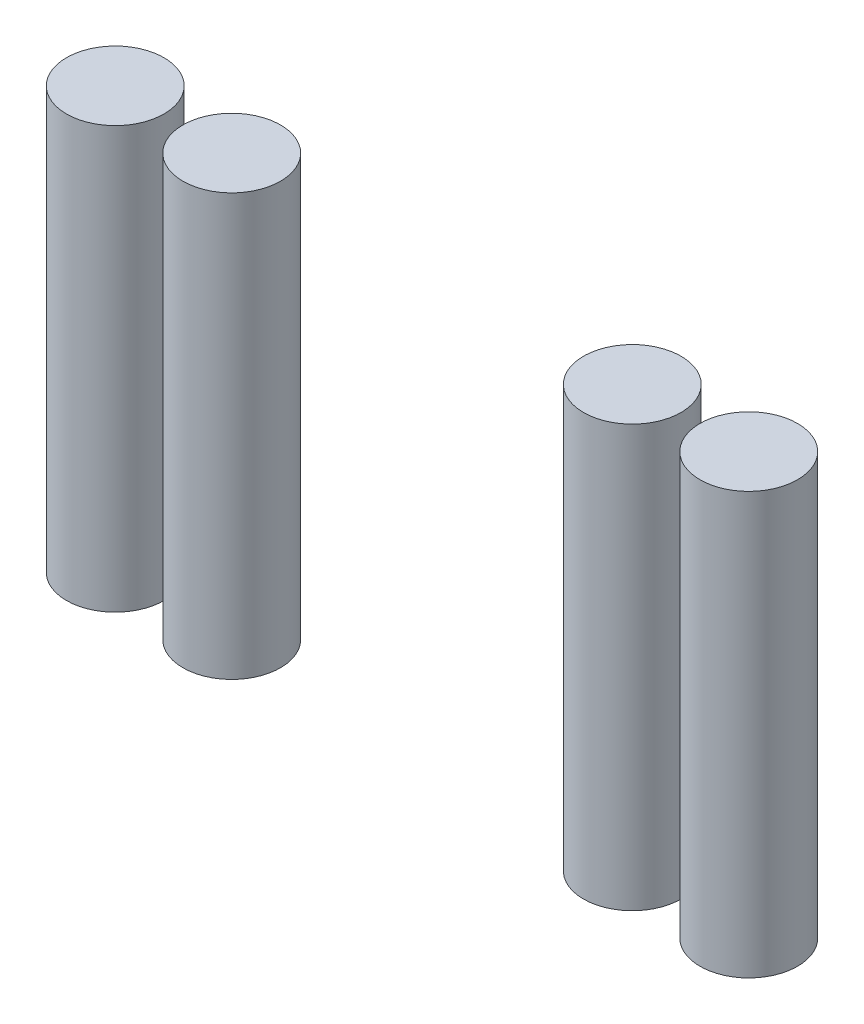
ISO-10303-21;
HEADER;
FILE_DESCRIPTION(('STEP AP214'),'2;1');
FILE_NAME('part.step','',(''),(''),'','','');
FILE_SCHEMA(('AUTOMOTIVE_DESIGN { 1 0 10303 214 1 1 1 1 }'));
ENDSEC;
DATA;
#1=APPLICATION_CONTEXT('core data for automotive mechanical design processes');
#2=APPLICATION_PROTOCOL_DEFINITION('international standard','automotive_design',2000,#1);
#3=PRODUCT_CONTEXT('',#1,'mechanical');
#4=PRODUCT('Part','Part','',(#3));
#5=PRODUCT_RELATED_PRODUCT_CATEGORY('part','',(#4));
#6=PRODUCT_DEFINITION_FORMATION('','',#4);
#7=PRODUCT_DEFINITION_CONTEXT('part definition',#1,'design');
#8=PRODUCT_DEFINITION('design','',#6,#7);
#9=PRODUCT_DEFINITION_SHAPE('','',#8);
#10=(LENGTH_UNIT() NAMED_UNIT(*) SI_UNIT(.MILLI.,.METRE.));
#11=(NAMED_UNIT(*) PLANE_ANGLE_UNIT() SI_UNIT($,.RADIAN.));
#12=(NAMED_UNIT(*) SI_UNIT($,.STERADIAN.) SOLID_ANGLE_UNIT());
#13=UNCERTAINTY_MEASURE_WITH_UNIT(LENGTH_MEASURE(1.E-05),#10,'distance_accuracy_value','');
#14=(GEOMETRIC_REPRESENTATION_CONTEXT(3) GLOBAL_UNCERTAINTY_ASSIGNED_CONTEXT((#13)) GLOBAL_UNIT_ASSIGNED_CONTEXT((#10,
#11,#12)) REPRESENTATION_CONTEXT('',''));
#15=CARTESIAN_POINT('',(0.,0.,0.));
#16=DIRECTION('',(0.,0.,1.));
#17=DIRECTION('',(1.,0.,0.));
#18=AXIS2_PLACEMENT_3D('',#15,#16,#17);
#19=CARTESIAN_POINT('',(-26.3,-22.25,7.35));
#20=DIRECTION('',(0.,-1.,0.));
#21=DIRECTION('',(0.,0.,-1.));
#22=AXIS2_PLACEMENT_3D('',#19,#20,#21);
#23=PLANE('',#22);
#24=CARTESIAN_POINT('',(-21.15,-22.25,12.5));
#25=DIRECTION('',(0.,1.,0.));
#26=DIRECTION('',(0.,0.,1.));
#27=AXIS2_PLACEMENT_3D('',#24,#25,#26);
#28=CIRCLE('',#27,5.15);
#29=CARTESIAN_POINT('',(-21.15,-22.25,17.65));
#30=VERTEX_POINT('',#29);
#31=EDGE_CURVE('P0_E18',#30,#30,#28,.T.);
#32=ORIENTED_EDGE('',*,*,#31,.F.);
#33=EDGE_LOOP('',(#32));
#34=FACE_BOUND('',#33,.T.);
#35=ADVANCED_FACE('P0_F15',(#34),#23,.T.);
#36=CARTESIAN_POINT('',(-16.,22.25,7.35));
#37=DIRECTION('',(0.,1.,0.));
#38=DIRECTION('',(0.,0.,1.));
#39=AXIS2_PLACEMENT_3D('',#36,#37,#38);
#40=PLANE('',#39);
#41=CARTESIAN_POINT('',(-21.15,22.25,12.5));
#42=DIRECTION('',(0.,1.,0.));
#43=DIRECTION('',(0.,0.,1.));
#44=AXIS2_PLACEMENT_3D('',#41,#42,#43);
#45=CIRCLE('',#44,5.15);
#46=CARTESIAN_POINT('',(-21.15,22.25,17.65));
#47=VERTEX_POINT('',#46);
#48=EDGE_CURVE('P0_E10',#47,#47,#45,.F.);
#49=ORIENTED_EDGE('',*,*,#48,.F.);
#50=EDGE_LOOP('',(#49));
#51=FACE_BOUND('',#50,.T.);
#52=ADVANCED_FACE('P0_F30',(#51),#40,.T.);
#53=CARTESIAN_POINT('',(-21.15,-164.9944754859,12.5));
#54=DIRECTION('',(0.,1.,0.));
#55=DIRECTION('',(0.,0.,1.));
#56=AXIS2_PLACEMENT_3D('',#53,#54,#55);
#57=CYLINDRICAL_SURFACE('',#56,5.15);
#58=ORIENTED_EDGE('',*,*,#31,.T.);
#59=EDGE_LOOP('',(#58));
#60=FACE_BOUND('',#59,.T.);
#61=ORIENTED_EDGE('',*,*,#48,.T.);
#62=EDGE_LOOP('',(#61));
#63=FACE_BOUND('',#62,.T.);
#64=ADVANCED_FACE('P0_F27',(#60,#63),#57,.T.);
#65=CLOSED_SHELL('',(#35,#52,#64));
#66=MANIFOLD_SOLID_BREP('P0_B1',#65);
#67=CARTESIAN_POINT('',(38.6,22.25,7.35));
#68=DIRECTION('',(0.,1.,0.));
#69=DIRECTION('',(0.,0.,1.));
#70=AXIS2_PLACEMENT_3D('',#67,#68,#69);
#71=PLANE('',#70);
#72=CARTESIAN_POINT('',(33.45,22.25,12.5));
#73=DIRECTION('',(0.,-1.,0.));
#74=DIRECTION('',(0.,0.,-1.));
#75=AXIS2_PLACEMENT_3D('',#72,#73,#74);
#76=CIRCLE('',#75,5.15);
#77=CARTESIAN_POINT('',(33.45,22.25,7.35));
#78=VERTEX_POINT('',#77);
#79=EDGE_CURVE('P1_E18',#78,#78,#76,.T.);
#80=ORIENTED_EDGE('',*,*,#79,.F.);
#81=EDGE_LOOP('',(#80));
#82=FACE_BOUND('',#81,.T.);
#83=ADVANCED_FACE('P1_F15',(#82),#71,.T.);
#84=CARTESIAN_POINT('',(28.3,-22.25,7.35));
#85=DIRECTION('',(0.,-1.,0.));
#86=DIRECTION('',(0.,0.,-1.));
#87=AXIS2_PLACEMENT_3D('',#84,#85,#86);
#88=PLANE('',#87);
#89=CARTESIAN_POINT('',(33.45,-22.25,12.5));
#90=DIRECTION('',(0.,-1.,0.));
#91=DIRECTION('',(0.,0.,-1.));
#92=AXIS2_PLACEMENT_3D('',#89,#90,#91);
#93=CIRCLE('',#92,5.15);
#94=CARTESIAN_POINT('',(33.45,-22.25,7.35));
#95=VERTEX_POINT('',#94);
#96=EDGE_CURVE('P1_E10',#95,#95,#93,.F.);
#97=ORIENTED_EDGE('',*,*,#96,.F.);
#98=EDGE_LOOP('',(#97));
#99=FACE_BOUND('',#98,.T.);
#100=ADVANCED_FACE('P1_F30',(#99),#88,.T.);
#101=CARTESIAN_POINT('',(33.45,180.36,12.5));
#102=DIRECTION('',(0.,-1.,0.));
#103=DIRECTION('',(0.,0.,-1.));
#104=AXIS2_PLACEMENT_3D('',#101,#102,#103);
#105=CYLINDRICAL_SURFACE('',#104,5.15);
#106=ORIENTED_EDGE('',*,*,#79,.T.);
#107=EDGE_LOOP('',(#106));
#108=FACE_BOUND('',#107,.T.);
#109=ORIENTED_EDGE('',*,*,#96,.T.);
#110=EDGE_LOOP('',(#109));
#111=FACE_BOUND('',#110,.T.);
#112=ADVANCED_FACE('P1_F27',(#108,#111),#105,.T.);
#113=CLOSED_SHELL('',(#83,#100,#112));
#114=MANIFOLD_SOLID_BREP('P1_B1',#113);
#115=CARTESIAN_POINT('',(-28.3,22.25,7.35));
#116=DIRECTION('',(0.,1.,0.));
#117=DIRECTION('',(0.,0.,1.));
#118=AXIS2_PLACEMENT_3D('',#115,#116,#117);
#119=PLANE('',#118);
#120=CARTESIAN_POINT('',(-33.45,22.25,12.5));
#121=DIRECTION('',(0.,1.,0.));
#122=DIRECTION('',(0.,0.,1.));
#123=AXIS2_PLACEMENT_3D('',#120,#121,#122);
#124=CIRCLE('',#123,5.15);
#125=CARTESIAN_POINT('',(-33.45,22.25,17.65));
#126=VERTEX_POINT('',#125);
#127=EDGE_CURVE('P2_E18',#126,#126,#124,.F.);
#128=ORIENTED_EDGE('',*,*,#127,.F.);
#129=EDGE_LOOP('',(#128));
#130=FACE_BOUND('',#129,.T.);
#131=ADVANCED_FACE('P2_F15',(#130),#119,.T.);
#132=CARTESIAN_POINT('',(-38.6,-22.25,7.35));
#133=DIRECTION('',(0.,-1.,0.));
#134=DIRECTION('',(0.,0.,-1.));
#135=AXIS2_PLACEMENT_3D('',#132,#133,#134);
#136=PLANE('',#135);
#137=CARTESIAN_POINT('',(-33.45,-22.25,12.5));
#138=DIRECTION('',(0.,1.,0.));
#139=DIRECTION('',(0.,0.,1.));
#140=AXIS2_PLACEMENT_3D('',#137,#138,#139);
#141=CIRCLE('',#140,5.15);
#142=CARTESIAN_POINT('',(-33.45,-22.25,17.65));
#143=VERTEX_POINT('',#142);
#144=EDGE_CURVE('P2_E10',#143,#143,#141,.T.);
#145=ORIENTED_EDGE('',*,*,#144,.F.);
#146=EDGE_LOOP('',(#145));
#147=FACE_BOUND('',#146,.T.);
#148=ADVANCED_FACE('P2_F30',(#147),#136,.T.);
#149=CARTESIAN_POINT('',(-33.45,-180.36,12.5));
#150=DIRECTION('',(0.,1.,0.));
#151=DIRECTION('',(0.,0.,1.));
#152=AXIS2_PLACEMENT_3D('',#149,#150,#151);
#153=CYLINDRICAL_SURFACE('',#152,5.15);
#154=ORIENTED_EDGE('',*,*,#127,.T.);
#155=EDGE_LOOP('',(#154));
#156=FACE_BOUND('',#155,.T.);
#157=ORIENTED_EDGE('',*,*,#144,.T.);
#158=EDGE_LOOP('',(#157));
#159=FACE_BOUND('',#158,.T.);
#160=ADVANCED_FACE('P2_F27',(#156,#159),#153,.T.);
#161=CLOSED_SHELL('',(#131,#148,#160));
#162=MANIFOLD_SOLID_BREP('P2_B1',#161);
#163=CARTESIAN_POINT('',(16.,-22.25,7.35));
#164=DIRECTION('',(0.,-1.,0.));
#165=DIRECTION('',(0.,0.,-1.));
#166=AXIS2_PLACEMENT_3D('',#163,#164,#165);
#167=PLANE('',#166);
#168=CARTESIAN_POINT('',(21.15,-22.25,12.5));
#169=DIRECTION('',(0.,1.,0.));
#170=DIRECTION('',(0.,0.,1.));
#171=AXIS2_PLACEMENT_3D('',#168,#169,#170);
#172=CIRCLE('',#171,5.15);
#173=CARTESIAN_POINT('',(21.15,-22.25,17.65));
#174=VERTEX_POINT('',#173);
#175=EDGE_CURVE('P3_E18',#174,#174,#172,.T.);
#176=ORIENTED_EDGE('',*,*,#175,.F.);
#177=EDGE_LOOP('',(#176));
#178=FACE_BOUND('',#177,.T.);
#179=ADVANCED_FACE('P3_F15',(#178),#167,.T.);
#180=CARTESIAN_POINT('',(26.3,22.25,7.35));
#181=DIRECTION('',(0.,1.,0.));
#182=DIRECTION('',(0.,0.,1.));
#183=AXIS2_PLACEMENT_3D('',#180,#181,#182);
#184=PLANE('',#183);
#185=CARTESIAN_POINT('',(21.15,22.25,12.5));
#186=DIRECTION('',(0.,1.,0.));
#187=DIRECTION('',(0.,0.,1.));
#188=AXIS2_PLACEMENT_3D('',#185,#186,#187);
#189=CIRCLE('',#188,5.15);
#190=CARTESIAN_POINT('',(21.15,22.25,17.65));
#191=VERTEX_POINT('',#190);
#192=EDGE_CURVE('P3_E10',#191,#191,#189,.F.);
#193=ORIENTED_EDGE('',*,*,#192,.F.);
#194=EDGE_LOOP('',(#193));
#195=FACE_BOUND('',#194,.T.);
#196=ADVANCED_FACE('P3_F30',(#195),#184,.T.);
#197=CARTESIAN_POINT('',(21.15,-180.36,12.5));
#198=DIRECTION('',(0.,1.,0.));
#199=DIRECTION('',(0.,0.,1.));
#200=AXIS2_PLACEMENT_3D('',#197,#198,#199);
#201=CYLINDRICAL_SURFACE('',#200,5.15);
#202=ORIENTED_EDGE('',*,*,#175,.T.);
#203=EDGE_LOOP('',(#202));
#204=FACE_BOUND('',#203,.T.);
#205=ORIENTED_EDGE('',*,*,#192,.T.);
#206=EDGE_LOOP('',(#205));
#207=FACE_BOUND('',#206,.T.);
#208=ADVANCED_FACE('P3_F27',(#204,#207),#201,.T.);
#209=CLOSED_SHELL('',(#179,#196,#208));
#210=MANIFOLD_SOLID_BREP('P3_B1',#209);
#211=ADVANCED_BREP_SHAPE_REPRESENTATION('',(#18,#66,#114,#162,#210),#14);
#212=SHAPE_DEFINITION_REPRESENTATION(#9,#211);
ENDSEC;
END-ISO-10303-21;
